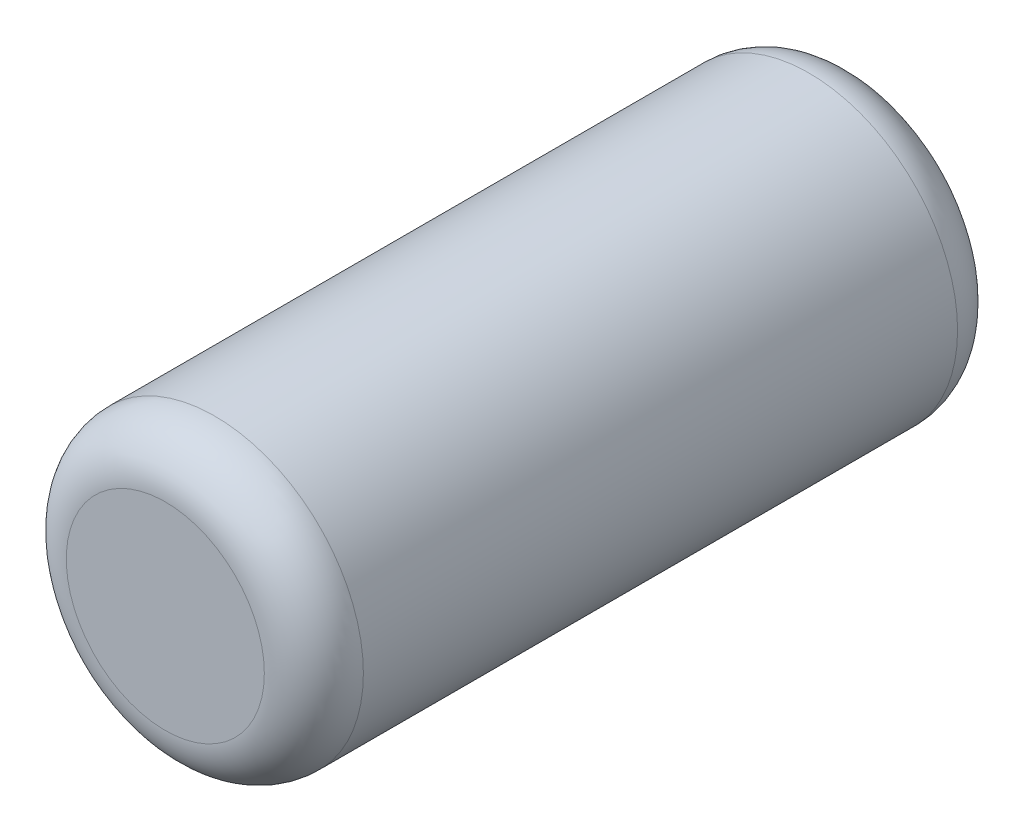
ISO-10303-21;
HEADER;
FILE_DESCRIPTION(('STEP AP214'),'2;1');
FILE_NAME('part.step','',(''),(''),'','','');
FILE_SCHEMA(('AUTOMOTIVE_DESIGN { 1 0 10303 214 1 1 1 1 }'));
ENDSEC;
DATA;
#1=APPLICATION_CONTEXT('core data for automotive mechanical design processes');
#2=APPLICATION_PROTOCOL_DEFINITION('international standard','automotive_design',2000,#1);
#3=PRODUCT_CONTEXT('',#1,'mechanical');
#4=PRODUCT('Part','Part','',(#3));
#5=PRODUCT_RELATED_PRODUCT_CATEGORY('part','',(#4));
#6=PRODUCT_DEFINITION_FORMATION('','',#4);
#7=PRODUCT_DEFINITION_CONTEXT('part definition',#1,'design');
#8=PRODUCT_DEFINITION('design','',#6,#7);
#9=PRODUCT_DEFINITION_SHAPE('','',#8);
#10=(LENGTH_UNIT() NAMED_UNIT(*) SI_UNIT(.MILLI.,.METRE.));
#11=(NAMED_UNIT(*) PLANE_ANGLE_UNIT() SI_UNIT($,.RADIAN.));
#12=(NAMED_UNIT(*) SI_UNIT($,.STERADIAN.) SOLID_ANGLE_UNIT());
#13=UNCERTAINTY_MEASURE_WITH_UNIT(LENGTH_MEASURE(1.E-05),#10,'distance_accuracy_value','');
#14=(GEOMETRIC_REPRESENTATION_CONTEXT(3) GLOBAL_UNCERTAINTY_ASSIGNED_CONTEXT((#13)) GLOBAL_UNIT_ASSIGNED_CONTEXT((#10,
#11,#12)) REPRESENTATION_CONTEXT('',''));
#15=CARTESIAN_POINT('',(0.,0.,0.));
#16=DIRECTION('',(0.,0.,1.));
#17=DIRECTION('',(1.,0.,0.));
#18=AXIS2_PLACEMENT_3D('',#15,#16,#17);
#19=CARTESIAN_POINT('',(0.,0.,7.));
#20=DIRECTION('',(0.,0.,-1.));
#21=DIRECTION('',(-1.,0.,0.));
#22=AXIS2_PLACEMENT_3D('',#19,#20,#21);
#23=CYLINDRICAL_SURFACE('',#22,1.5);
#24=CARTESIAN_POINT('',(0.,0.,0.5));
#25=DIRECTION('',(0.,0.,1.));
#26=DIRECTION('',(1.,0.,0.));
#27=AXIS2_PLACEMENT_3D('',#24,#25,#26);
#28=CIRCLE('',#27,1.5);
#29=CARTESIAN_POINT('',(1.5,0.,0.5));
#30=VERTEX_POINT('',#29);
#31=EDGE_CURVE('E40',#30,#30,#28,.T.);
#32=ORIENTED_EDGE('',*,*,#31,.T.);
#33=EDGE_LOOP('',(#32));
#34=FACE_BOUND('',#33,.T.);
#35=CARTESIAN_POINT('',(0.,0.,6.5));
#36=DIRECTION('',(0.,0.,1.));
#37=DIRECTION('',(1.,0.,0.));
#38=AXIS2_PLACEMENT_3D('',#35,#36,#37);
#39=CIRCLE('',#38,1.5);
#40=CARTESIAN_POINT('',(1.5,0.,6.5));
#41=VERTEX_POINT('',#40);
#42=EDGE_CURVE('E44',#41,#41,#39,.F.);
#43=ORIENTED_EDGE('',*,*,#42,.T.);
#44=EDGE_LOOP('',(#43));
#45=FACE_BOUND('',#44,.T.);
#46=ADVANCED_FACE('F29',(#34,#45),#23,.T.);
#47=CARTESIAN_POINT('',(0.,0.,7.));
#48=DIRECTION('',(0.,0.,1.));
#49=DIRECTION('',(1.,0.,0.));
#50=AXIS2_PLACEMENT_3D('',#47,#48,#49);
#51=PLANE('',#50);
#52=CARTESIAN_POINT('',(0.,0.,7.));
#53=DIRECTION('',(0.,0.,1.));
#54=DIRECTION('',(1.,0.,0.));
#55=AXIS2_PLACEMENT_3D('',#52,#53,#54);
#56=CIRCLE('',#55,1.);
#57=CARTESIAN_POINT('',(1.,0.,7.));
#58=VERTEX_POINT('',#57);
#59=EDGE_CURVE('E10',#58,#58,#56,.T.);
#60=ORIENTED_EDGE('',*,*,#59,.T.);
#61=EDGE_LOOP('',(#60));
#62=FACE_BOUND('',#61,.T.);
#63=ADVANCED_FACE('F60',(#62),#51,.T.);
#64=CARTESIAN_POINT('',(0.,0.,0.));
#65=DIRECTION('',(0.,0.,1.));
#66=DIRECTION('',(1.,0.,0.));
#67=AXIS2_PLACEMENT_3D('',#64,#65,#66);
#68=PLANE('',#67);
#69=CARTESIAN_POINT('',(0.,0.,0.));
#70=DIRECTION('',(0.,0.,1.));
#71=DIRECTION('',(1.,0.,0.));
#72=AXIS2_PLACEMENT_3D('',#69,#70,#71);
#73=CIRCLE('',#72,1.);
#74=CARTESIAN_POINT('',(1.,0.,0.));
#75=VERTEX_POINT('',#74);
#76=EDGE_CURVE('E36',#75,#75,#73,.F.);
#77=ORIENTED_EDGE('',*,*,#76,.T.);
#78=EDGE_LOOP('',(#77));
#79=FACE_BOUND('',#78,.T.);
#80=ADVANCED_FACE('F57',(#79),#68,.F.);
#81=CARTESIAN_POINT('',(0.,0.,0.5));
#82=DIRECTION('',(0.,0.,1.));
#83=DIRECTION('',(1.,0.,0.));
#84=AXIS2_PLACEMENT_3D('',#81,#82,#83);
#85=TOROIDAL_SURFACE('',#84,1.,0.5);
#86=ORIENTED_EDGE('',*,*,#76,.F.);
#87=EDGE_LOOP('',(#86));
#88=FACE_BOUND('',#87,.T.);
#89=ORIENTED_EDGE('',*,*,#31,.F.);
#90=EDGE_LOOP('',(#89));
#91=FACE_BOUND('',#90,.T.);
#92=ADVANCED_FACE('F53',(#88,#91),#85,.T.);
#93=CARTESIAN_POINT('',(0.,0.,6.5));
#94=DIRECTION('',(0.,0.,1.));
#95=DIRECTION('',(1.,0.,0.));
#96=AXIS2_PLACEMENT_3D('',#93,#94,#95);
#97=TOROIDAL_SURFACE('',#96,1.,0.5);
#98=ORIENTED_EDGE('',*,*,#42,.F.);
#99=EDGE_LOOP('',(#98));
#100=FACE_BOUND('',#99,.T.);
#101=ORIENTED_EDGE('',*,*,#59,.F.);
#102=EDGE_LOOP('',(#101));
#103=FACE_BOUND('',#102,.T.);
#104=ADVANCED_FACE('F31',(#100,#103),#97,.T.);
#105=CLOSED_SHELL('',(#46,#63,#80,#92,#104));
#106=MANIFOLD_SOLID_BREP('B2',#105);
#107=ADVANCED_BREP_SHAPE_REPRESENTATION('',(#18,#106),#14);
#108=SHAPE_DEFINITION_REPRESENTATION(#9,#107);
ENDSEC;
END-ISO-10303-21;
